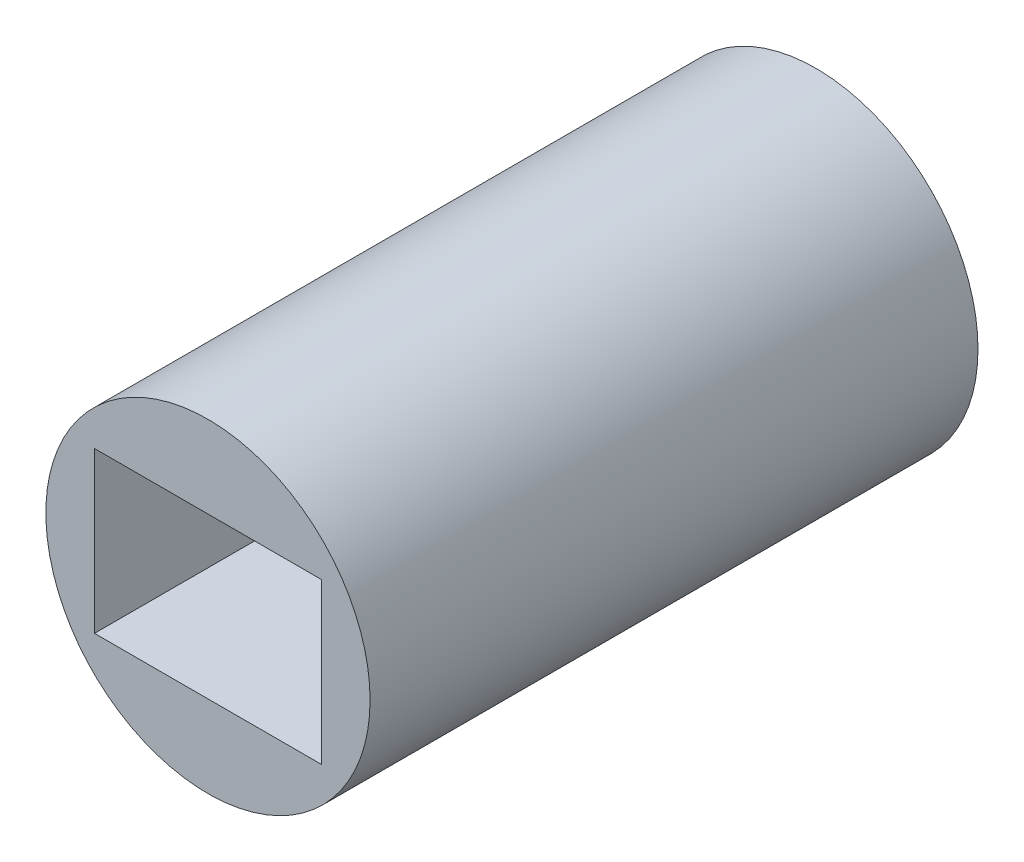
ISO-10303-21;
HEADER;
FILE_DESCRIPTION(('STEP AP214'),'2;1');
FILE_NAME('part.step','',(''),(''),'','','');
FILE_SCHEMA(('AUTOMOTIVE_DESIGN { 1 0 10303 214 1 1 1 1 }'));
ENDSEC;
DATA;
#1=APPLICATION_CONTEXT('core data for automotive mechanical design processes');
#2=APPLICATION_PROTOCOL_DEFINITION('international standard','automotive_design',2000,#1);
#3=PRODUCT_CONTEXT('',#1,'mechanical');
#4=PRODUCT('Part','Part','',(#3));
#5=PRODUCT_RELATED_PRODUCT_CATEGORY('part','',(#4));
#6=PRODUCT_DEFINITION_FORMATION('','',#4);
#7=PRODUCT_DEFINITION_CONTEXT('part definition',#1,'design');
#8=PRODUCT_DEFINITION('design','',#6,#7);
#9=PRODUCT_DEFINITION_SHAPE('','',#8);
#10=(LENGTH_UNIT() NAMED_UNIT(*) SI_UNIT(.MILLI.,.METRE.));
#11=(NAMED_UNIT(*) PLANE_ANGLE_UNIT() SI_UNIT($,.RADIAN.));
#12=(NAMED_UNIT(*) SI_UNIT($,.STERADIAN.) SOLID_ANGLE_UNIT());
#13=UNCERTAINTY_MEASURE_WITH_UNIT(LENGTH_MEASURE(1.E-05),#10,'distance_accuracy_value','');
#14=(GEOMETRIC_REPRESENTATION_CONTEXT(3) GLOBAL_UNCERTAINTY_ASSIGNED_CONTEXT((#13)) GLOBAL_UNIT_ASSIGNED_CONTEXT((#10,
#11,#12)) REPRESENTATION_CONTEXT('',''));
#15=CARTESIAN_POINT('',(0.,0.,0.));
#16=DIRECTION('',(0.,0.,1.));
#17=DIRECTION('',(1.,0.,0.));
#18=AXIS2_PLACEMENT_3D('',#15,#16,#17);
#19=CARTESIAN_POINT('',(0.,0.,7.));
#20=DIRECTION('',(0.,0.,-1.));
#21=DIRECTION('',(-1.,0.,0.));
#22=AXIS2_PLACEMENT_3D('',#19,#20,#21);
#23=PLANE('',#22);
#24=DIRECTION('',(-1.,0.,0.));
#25=VECTOR('',#24,1.);
#26=CARTESIAN_POINT('',(-2.8,1.975,7.));
#27=LINE('',#26,#25);
#28=CARTESIAN_POINT('',(2.8,1.975,7.));
#29=VERTEX_POINT('',#28);
#30=CARTESIAN_POINT('',(0.954226095746665,1.975,7.));
#31=VERTEX_POINT('',#30);
#32=EDGE_CURVE('E322',#29,#31,#27,.T.);
#33=ORIENTED_EDGE('',*,*,#32,.T.);
#34=DIRECTION('',(0.,-1.,0.));
#35=VECTOR('',#34,1.);
#36=CARTESIAN_POINT('',(0.954226095746662,0.,7.));
#37=LINE('',#36,#35);
#38=CARTESIAN_POINT('',(0.954226095746664,1.44772926198689,7.));
#39=VERTEX_POINT('',#38);
#40=EDGE_CURVE('E237',#31,#39,#37,.T.);
#41=ORIENTED_EDGE('',*,*,#40,.T.);
#42=CARTESIAN_POINT('',(1.71167067400128,1.70517384024148,7.));
#43=DIRECTION('',(0.,0.,-1.));
#44=DIRECTION('',(-1.,0.,0.));
#45=AXIS2_PLACEMENT_3D('',#42,#43,#44);
#46=CIRCLE('',#45,0.800000000000001);
#47=CARTESIAN_POINT('',(1.45422609574668,0.947729261986869,7.));
#48=VERTEX_POINT('',#47);
#49=EDGE_CURVE('E241',#48,#39,#46,.T.);
#50=ORIENTED_EDGE('',*,*,#49,.F.);
#51=DIRECTION('',(-1.,0.,0.));
#52=VECTOR('',#51,1.);
#53=CARTESIAN_POINT('',(0.,0.947729261986868,7.));
#54=LINE('',#53,#52);
#55=CARTESIAN_POINT('',(2.4530907267401,0.94772926198687,7.));
#56=VERTEX_POINT('',#55);
#57=EDGE_CURVE('E243',#56,#48,#54,.T.);
#58=ORIENTED_EDGE('',*,*,#57,.F.);
#59=CARTESIAN_POINT('',(-1.43245942735649,-0.00227073801313066,7.));
#60=DIRECTION('',(0.,0.,-1.));
#61=DIRECTION('',(-1.,0.,0.));
#62=AXIS2_PLACEMENT_3D('',#59,#60,#61);
#63=CIRCLE('',#62,4.);
#64=CARTESIAN_POINT('',(2.4530907267401,-0.952270738013131,7.));
#65=VERTEX_POINT('',#64);
#66=EDGE_CURVE('E189',#56,#65,#63,.T.);
#67=ORIENTED_EDGE('',*,*,#66,.T.);
#68=DIRECTION('',(-1.,0.,0.));
#69=VECTOR('',#68,1.);
#70=CARTESIAN_POINT('',(0.,-0.952270738013128,7.));
#71=LINE('',#70,#69);
#72=CARTESIAN_POINT('',(1.45195535773355,-0.95227073801313,7.));
#73=VERTEX_POINT('',#72);
#74=EDGE_CURVE('E186',#65,#73,#71,.T.);
#75=ORIENTED_EDGE('',*,*,#74,.T.);
#76=CARTESIAN_POINT('',(1.70939993598815,-1.70971531626775,7.));
#77=DIRECTION('',(0.,0.,-1.));
#78=DIRECTION('',(-1.,0.,0.));
#79=AXIS2_PLACEMENT_3D('',#76,#77,#78);
#80=CIRCLE('',#79,0.800000000000001);
#81=CARTESIAN_POINT('',(0.951955357733533,-1.45227073801315,7.));
#82=VERTEX_POINT('',#81);
#83=EDGE_CURVE('E192',#73,#82,#80,.F.);
#84=ORIENTED_EDGE('',*,*,#83,.T.);
#85=DIRECTION('',(0.,1.,0.));
#86=VECTOR('',#85,1.);
#87=CARTESIAN_POINT('',(0.951955357733533,0.,7.));
#88=LINE('',#87,#86);
#89=CARTESIAN_POINT('',(0.951955357733533,-1.975,7.));
#90=VERTEX_POINT('',#89);
#91=EDGE_CURVE('E196',#90,#82,#88,.T.);
#92=ORIENTED_EDGE('',*,*,#91,.F.);
#93=DIRECTION('',(1.,0.,0.));
#94=VECTOR('',#93,1.);
#95=CARTESIAN_POINT('',(-2.8,-1.975,7.));
#96=LINE('',#95,#94);
#97=CARTESIAN_POINT('',(2.8,-1.975,7.));
#98=VERTEX_POINT('',#97);
#99=EDGE_CURVE('E328',#90,#98,#96,.T.);
#100=ORIENTED_EDGE('',*,*,#99,.T.);
#101=DIRECTION('',(0.,1.,0.));
#102=VECTOR('',#101,1.);
#103=CARTESIAN_POINT('',(2.8,-1.975,7.));
#104=LINE('',#103,#102);
#105=EDGE_CURVE('E317',#98,#29,#104,.T.);
#106=ORIENTED_EDGE('',*,*,#105,.T.);
#107=EDGE_LOOP('',(#33,#41,#50,#58,#67,#75,#84,#92,#100,#106));
#108=FACE_BOUND('',#107,.T.);
#109=ADVANCED_FACE('F35',(#108),#23,.F.);
#110=CARTESIAN_POINT('',(0.,0.,0.));
#111=DIRECTION('',(0.,0.,1.));
#112=DIRECTION('',(1.,0.,0.));
#113=AXIS2_PLACEMENT_3D('',#110,#111,#112);
#114=PLANE('',#113);
#115=CARTESIAN_POINT('',(0.,0.,0.));
#116=DIRECTION('',(0.,0.,1.));
#117=DIRECTION('',(1.,0.,0.));
#118=AXIS2_PLACEMENT_3D('',#115,#116,#117);
#119=CIRCLE('',#118,4.);
#120=CARTESIAN_POINT('',(4.,0.,0.));
#121=VERTEX_POINT('',#120);
#122=EDGE_CURVE('E39',#121,#121,#119,.T.);
#123=ORIENTED_EDGE('',*,*,#122,.F.);
#124=EDGE_LOOP('',(#123));
#125=FACE_BOUND('',#124,.T.);
#126=CARTESIAN_POINT('',(1.70939993598815,-1.70971531626775,0.));
#127=DIRECTION('',(0.,0.,-1.));
#128=DIRECTION('',(-1.,0.,0.));
#129=AXIS2_PLACEMENT_3D('',#126,#127,#128);
#130=CIRCLE('',#129,0.800000000000001);
#131=CARTESIAN_POINT('',(1.45195535773355,-0.95227073801313,0.));
#132=VERTEX_POINT('',#131);
#133=CARTESIAN_POINT('',(0.951955357733533,-1.45227073801315,0.));
#134=VERTEX_POINT('',#133);
#135=EDGE_CURVE('E247',#132,#134,#130,.F.);
#136=ORIENTED_EDGE('',*,*,#135,.F.);
#137=DIRECTION('',(-1.,0.,0.));
#138=VECTOR('',#137,1.);
#139=CARTESIAN_POINT('',(0.,-0.952270738013128,0.));
#140=LINE('',#139,#138);
#141=CARTESIAN_POINT('',(2.4530907267401,-0.952270738013131,0.));
#142=VERTEX_POINT('',#141);
#143=EDGE_CURVE('E58',#142,#132,#140,.T.);
#144=ORIENTED_EDGE('',*,*,#143,.F.);
#145=CARTESIAN_POINT('',(-1.43245942735649,-0.00227073801313066,0.));
#146=DIRECTION('',(0.,0.,-1.));
#147=DIRECTION('',(-1.,0.,0.));
#148=AXIS2_PLACEMENT_3D('',#145,#146,#147);
#149=CIRCLE('',#148,4.);
#150=CARTESIAN_POINT('',(2.4530907267401,0.94772926198687,0.));
#151=VERTEX_POINT('',#150);
#152=EDGE_CURVE('E201',#151,#142,#149,.T.);
#153=ORIENTED_EDGE('',*,*,#152,.F.);
#154=DIRECTION('',(-1.,0.,0.));
#155=VECTOR('',#154,1.);
#156=CARTESIAN_POINT('',(0.,0.947729261986868,0.));
#157=LINE('',#156,#155);
#158=CARTESIAN_POINT('',(1.45422609574668,0.947729261986869,0.));
#159=VERTEX_POINT('',#158);
#160=EDGE_CURVE('E204',#151,#159,#157,.T.);
#161=ORIENTED_EDGE('',*,*,#160,.T.);
#162=CARTESIAN_POINT('',(1.71167067400128,1.70517384024148,0.));
#163=DIRECTION('',(0.,0.,-1.));
#164=DIRECTION('',(-1.,0.,0.));
#165=AXIS2_PLACEMENT_3D('',#162,#163,#164);
#166=CIRCLE('',#165,0.800000000000001);
#167=CARTESIAN_POINT('',(0.954226095746664,1.44772926198689,0.));
#168=VERTEX_POINT('',#167);
#169=EDGE_CURVE('E282',#159,#168,#166,.T.);
#170=ORIENTED_EDGE('',*,*,#169,.T.);
#171=DIRECTION('',(0.,-1.,0.));
#172=VECTOR('',#171,1.);
#173=CARTESIAN_POINT('',(0.954226095746662,0.,0.));
#174=LINE('',#173,#172);
#175=CARTESIAN_POINT('',(0.954226095746666,2.44886463099344,0.));
#176=VERTEX_POINT('',#175);
#177=EDGE_CURVE('E279',#176,#168,#174,.T.);
#178=ORIENTED_EDGE('',*,*,#177,.F.);
#179=CARTESIAN_POINT('',(0.00422609574666499,-1.43668552310315,0.));
#180=DIRECTION('',(0.,0.,-1.));
#181=DIRECTION('',(-1.,0.,0.));
#182=AXIS2_PLACEMENT_3D('',#179,#180,#181);
#183=CIRCLE('',#182,4.);
#184=CARTESIAN_POINT('',(-0.945773904253334,2.44886463099344,0.));
#185=VERTEX_POINT('',#184);
#186=EDGE_CURVE('E276',#185,#176,#183,.T.);
#187=ORIENTED_EDGE('',*,*,#186,.F.);
#188=DIRECTION('',(0.,-1.,0.));
#189=VECTOR('',#188,1.);
#190=CARTESIAN_POINT('',(-0.945773904253335,0.,0.));
#191=LINE('',#190,#189);
#192=CARTESIAN_POINT('',(-0.945773904253334,1.45000000000002,0.));
#193=VERTEX_POINT('',#192);
#194=EDGE_CURVE('E273',#185,#193,#191,.T.);
#195=ORIENTED_EDGE('',*,*,#194,.T.);
#196=CARTESIAN_POINT('',(-1.70321848250795,1.70744457825462,0.));
#197=DIRECTION('',(0.,0.,-1.));
#198=DIRECTION('',(-1.,0.,0.));
#199=AXIS2_PLACEMENT_3D('',#196,#197,#198);
#200=CIRCLE('',#199,0.8);
#201=CARTESIAN_POINT('',(-1.44577390425335,0.95,0.));
#202=VERTEX_POINT('',#201);
#203=EDGE_CURVE('E270',#193,#202,#200,.T.);
#204=ORIENTED_EDGE('',*,*,#203,.T.);
#205=DIRECTION('',(1.,0.,0.));
#206=VECTOR('',#205,1.);
#207=CARTESIAN_POINT('',(0.,0.949999999999997,0.));
#208=LINE('',#207,#206);
#209=CARTESIAN_POINT('',(-2.4469092732599,0.950000000000002,0.));
#210=VERTEX_POINT('',#209);
#211=EDGE_CURVE('E267',#210,#202,#208,.T.);
#212=ORIENTED_EDGE('',*,*,#211,.F.);
#213=CARTESIAN_POINT('',(1.43864088083668,0.,0.));
#214=DIRECTION('',(0.,0.,-1.));
#215=DIRECTION('',(-1.,0.,0.));
#216=AXIS2_PLACEMENT_3D('',#213,#214,#215);
#217=CIRCLE('',#216,4.);
#218=CARTESIAN_POINT('',(-2.4469092732599,-0.949999999999998,0.));
#219=VERTEX_POINT('',#218);
#220=EDGE_CURVE('E264',#219,#210,#217,.T.);
#221=ORIENTED_EDGE('',*,*,#220,.F.);
#222=DIRECTION('',(1.,0.,0.));
#223=VECTOR('',#222,1.);
#224=CARTESIAN_POINT('',(0.,-0.95,0.));
#225=LINE('',#224,#223);
#226=CARTESIAN_POINT('',(-1.44804464226649,-0.949999999999999,0.));
#227=VERTEX_POINT('',#226);
#228=EDGE_CURVE('E261',#219,#227,#225,.T.);
#229=ORIENTED_EDGE('',*,*,#228,.T.);
#230=CARTESIAN_POINT('',(-1.76445974035885,-1.76641509809238,0.));
#231=DIRECTION('',(0.,0.,-1.));
#232=DIRECTION('',(-1.,0.,0.));
#233=AXIS2_PLACEMENT_3D('',#230,#231,#232);
#234=CIRCLE('',#233,0.875586732822055);
#235=CARTESIAN_POINT('',(-0.948044642266466,-1.45000000000002,0.));
#236=VERTEX_POINT('',#235);
#237=EDGE_CURVE('E258',#236,#227,#234,.F.);
#238=ORIENTED_EDGE('',*,*,#237,.F.);
#239=DIRECTION('',(0.,1.,0.));
#240=VECTOR('',#239,1.);
#241=CARTESIAN_POINT('',(-0.948044642266465,0.,0.));
#242=LINE('',#241,#240);
#243=CARTESIAN_POINT('',(-0.948044642266466,-2.45113536900657,0.));
#244=VERTEX_POINT('',#243);
#245=EDGE_CURVE('E255',#244,#236,#242,.T.);
#246=ORIENTED_EDGE('',*,*,#245,.F.);
#247=CARTESIAN_POINT('',(0.00195535773353365,1.43441478509002,0.));
#248=DIRECTION('',(0.,0.,-1.));
#249=DIRECTION('',(-1.,0.,0.));
#250=AXIS2_PLACEMENT_3D('',#247,#248,#249);
#251=CIRCLE('',#250,4.);
#252=CARTESIAN_POINT('',(0.951955357733533,-2.45113536900657,0.));
#253=VERTEX_POINT('',#252);
#254=EDGE_CURVE('E252',#253,#244,#251,.T.);
#255=ORIENTED_EDGE('',*,*,#254,.F.);
#256=DIRECTION('',(0.,1.,0.));
#257=VECTOR('',#256,1.);
#258=CARTESIAN_POINT('',(0.951955357733533,0.,0.));
#259=LINE('',#258,#257);
#260=EDGE_CURVE('E249',#253,#134,#259,.T.);
#261=ORIENTED_EDGE('',*,*,#260,.T.);
#262=EDGE_LOOP('',(#136,#144,#153,#161,#170,#178,#187,#195,#204,#212,#221,#229,#238,#246,#255,#261));
#263=FACE_BOUND('',#262,.T.);
#264=ADVANCED_FACE('F391',(#125,#263),#114,.F.);
#265=CARTESIAN_POINT('',(0.,0.,15.));
#266=DIRECTION('',(0.,0.,-1.));
#267=DIRECTION('',(-1.,0.,0.));
#268=AXIS2_PLACEMENT_3D('',#265,#266,#267);
#269=CYLINDRICAL_SURFACE('',#268,4.);
#270=CARTESIAN_POINT('',(0.,0.,15.));
#271=DIRECTION('',(0.,0.,1.));
#272=DIRECTION('',(1.,0.,0.));
#273=AXIS2_PLACEMENT_3D('',#270,#271,#272);
#274=CIRCLE('',#273,4.);
#275=CARTESIAN_POINT('',(4.,0.,15.));
#276=VERTEX_POINT('',#275);
#277=EDGE_CURVE('E11',#276,#276,#274,.T.);
#278=ORIENTED_EDGE('',*,*,#277,.F.);
#279=EDGE_LOOP('',(#278));
#280=FACE_BOUND('',#279,.T.);
#281=ORIENTED_EDGE('',*,*,#122,.T.);
#282=EDGE_LOOP('',(#281));
#283=FACE_BOUND('',#282,.T.);
#284=ADVANCED_FACE('F37',(#280,#283),#269,.T.);
#285=CARTESIAN_POINT('',(0.,0.,15.));
#286=DIRECTION('',(0.,0.,1.));
#287=DIRECTION('',(1.,0.,0.));
#288=AXIS2_PLACEMENT_3D('',#285,#286,#287);
#289=PLANE('',#288);
#290=DIRECTION('',(0.,1.,0.));
#291=VECTOR('',#290,1.);
#292=CARTESIAN_POINT('',(2.8,-1.975,15.));
#293=LINE('',#292,#291);
#294=CARTESIAN_POINT('',(2.8,-1.975,15.));
#295=VERTEX_POINT('',#294);
#296=CARTESIAN_POINT('',(2.8,1.975,15.));
#297=VERTEX_POINT('',#296);
#298=EDGE_CURVE('E289',#295,#297,#293,.T.);
#299=ORIENTED_EDGE('',*,*,#298,.F.);
#300=DIRECTION('',(1.,0.,0.));
#301=VECTOR('',#300,1.);
#302=CARTESIAN_POINT('',(-2.8,-1.975,15.));
#303=LINE('',#302,#301);
#304=CARTESIAN_POINT('',(-2.8,-1.975,15.));
#305=VERTEX_POINT('',#304);
#306=EDGE_CURVE('E321',#305,#295,#303,.T.);
#307=ORIENTED_EDGE('',*,*,#306,.F.);
#308=DIRECTION('',(0.,-1.,0.));
#309=VECTOR('',#308,1.);
#310=CARTESIAN_POINT('',(-2.8,-1.975,15.));
#311=LINE('',#310,#309);
#312=CARTESIAN_POINT('',(-2.8,1.975,15.));
#313=VERTEX_POINT('',#312);
#314=EDGE_CURVE('E338',#313,#305,#311,.T.);
#315=ORIENTED_EDGE('',*,*,#314,.F.);
#316=DIRECTION('',(-1.,0.,0.));
#317=VECTOR('',#316,1.);
#318=CARTESIAN_POINT('',(-2.8,1.975,15.));
#319=LINE('',#318,#317);
#320=EDGE_CURVE('E335',#297,#313,#319,.T.);
#321=ORIENTED_EDGE('',*,*,#320,.F.);
#322=EDGE_LOOP('',(#299,#307,#315,#321));
#323=FACE_BOUND('',#322,.T.);
#324=ORIENTED_EDGE('',*,*,#277,.T.);
#325=EDGE_LOOP('',(#324));
#326=FACE_BOUND('',#325,.T.);
#327=ADVANCED_FACE('F361',(#323,#326),#289,.T.);
#328=CARTESIAN_POINT('',(2.8,-1.975,7.));
#329=DIRECTION('',(1.,0.,0.));
#330=DIRECTION('',(0.,0.,-1.));
#331=AXIS2_PLACEMENT_3D('',#328,#329,#330);
#332=PLANE('',#331);
#333=ORIENTED_EDGE('',*,*,#298,.T.);
#334=DIRECTION('',(0.,0.,1.));
#335=VECTOR('',#334,1.);
#336=CARTESIAN_POINT('',(2.8,1.975,7.));
#337=LINE('',#336,#335);
#338=EDGE_CURVE('E332',#29,#297,#337,.T.);
#339=ORIENTED_EDGE('',*,*,#338,.F.);
#340=ORIENTED_EDGE('',*,*,#105,.F.);
#341=DIRECTION('',(0.,0.,1.));
#342=VECTOR('',#341,1.);
#343=CARTESIAN_POINT('',(2.8,-1.975,7.));
#344=LINE('',#343,#342);
#345=EDGE_CURVE('E343',#98,#295,#344,.T.);
#346=ORIENTED_EDGE('',*,*,#345,.T.);
#347=EDGE_LOOP('',(#333,#339,#340,#346));
#348=FACE_BOUND('',#347,.T.);
#349=ADVANCED_FACE('F403',(#348),#332,.F.);
#350=CARTESIAN_POINT('',(-2.8,-1.975,7.));
#351=DIRECTION('',(0.,-1.,0.));
#352=DIRECTION('',(0.,0.,-1.));
#353=AXIS2_PLACEMENT_3D('',#350,#351,#352);
#354=PLANE('',#353);
#355=ORIENTED_EDGE('',*,*,#306,.T.);
#356=ORIENTED_EDGE('',*,*,#345,.F.);
#357=ORIENTED_EDGE('',*,*,#99,.F.);
#358=CARTESIAN_POINT('',(-0.948044642266466,-1.975,7.));
#359=VERTEX_POINT('',#358);
#360=EDGE_CURVE('E333',#359,#90,#96,.T.);
#361=ORIENTED_EDGE('',*,*,#360,.F.);
#362=CARTESIAN_POINT('',(-2.8,-1.975,7.));
#363=VERTEX_POINT('',#362);
#364=EDGE_CURVE('E329',#363,#359,#96,.T.);
#365=ORIENTED_EDGE('',*,*,#364,.F.);
#366=DIRECTION('',(0.,0.,1.));
#367=VECTOR('',#366,1.);
#368=CARTESIAN_POINT('',(-2.8,-1.975,7.));
#369=LINE('',#368,#367);
#370=EDGE_CURVE('E345',#363,#305,#369,.T.);
#371=ORIENTED_EDGE('',*,*,#370,.T.);
#372=EDGE_LOOP('',(#355,#356,#357,#361,#365,#371));
#373=FACE_BOUND('',#372,.T.);
#374=ADVANCED_FACE('F405',(#373),#354,.F.);
#375=CARTESIAN_POINT('',(-2.8,-1.975,7.));
#376=DIRECTION('',(-1.,0.,0.));
#377=DIRECTION('',(0.,0.,1.));
#378=AXIS2_PLACEMENT_3D('',#375,#376,#377);
#379=PLANE('',#378);
#380=ORIENTED_EDGE('',*,*,#314,.T.);
#381=ORIENTED_EDGE('',*,*,#370,.F.);
#382=DIRECTION('',(0.,-1.,0.));
#383=VECTOR('',#382,1.);
#384=CARTESIAN_POINT('',(-2.8,-1.975,7.));
#385=LINE('',#384,#383);
#386=CARTESIAN_POINT('',(-2.8,1.975,7.));
#387=VERTEX_POINT('',#386);
#388=EDGE_CURVE('E324',#387,#363,#385,.T.);
#389=ORIENTED_EDGE('',*,*,#388,.F.);
#390=DIRECTION('',(0.,0.,1.));
#391=VECTOR('',#390,1.);
#392=CARTESIAN_POINT('',(-2.8,1.975,7.));
#393=LINE('',#392,#391);
#394=EDGE_CURVE('E347',#387,#313,#393,.T.);
#395=ORIENTED_EDGE('',*,*,#394,.T.);
#396=EDGE_LOOP('',(#380,#381,#389,#395));
#397=FACE_BOUND('',#396,.T.);
#398=ADVANCED_FACE('F365',(#397),#379,.F.);
#399=CARTESIAN_POINT('',(-2.8,1.975,7.));
#400=DIRECTION('',(0.,1.,0.));
#401=DIRECTION('',(0.,0.,1.));
#402=AXIS2_PLACEMENT_3D('',#399,#400,#401);
#403=PLANE('',#402);
#404=ORIENTED_EDGE('',*,*,#320,.T.);
#405=ORIENTED_EDGE('',*,*,#394,.F.);
#406=CARTESIAN_POINT('',(-0.945773904253334,1.975,7.));
#407=VERTEX_POINT('',#406);
#408=EDGE_CURVE('E320',#407,#387,#27,.T.);
#409=ORIENTED_EDGE('',*,*,#408,.F.);
#410=EDGE_CURVE('E325',#31,#407,#27,.T.);
#411=ORIENTED_EDGE('',*,*,#410,.F.);
#412=ORIENTED_EDGE('',*,*,#32,.F.);
#413=ORIENTED_EDGE('',*,*,#338,.T.);
#414=EDGE_LOOP('',(#404,#405,#409,#411,#412,#413));
#415=FACE_BOUND('',#414,.T.);
#416=ADVANCED_FACE('F353',(#415),#403,.F.);
#417=DIRECTION('',(0.,-1.,0.));
#418=VECTOR('',#417,1.);
#419=CARTESIAN_POINT('',(-0.945773904253335,0.,7.));
#420=LINE('',#419,#418);
#421=CARTESIAN_POINT('',(-0.945773904253334,1.45000000000002,7.));
#422=VERTEX_POINT('',#421);
#423=EDGE_CURVE('E230',#407,#422,#420,.T.);
#424=ORIENTED_EDGE('',*,*,#423,.F.);
#425=ORIENTED_EDGE('',*,*,#408,.T.);
#426=ORIENTED_EDGE('',*,*,#388,.T.);
#427=ORIENTED_EDGE('',*,*,#364,.T.);
#428=DIRECTION('',(0.,1.,0.));
#429=VECTOR('',#428,1.);
#430=CARTESIAN_POINT('',(-0.948044642266465,0.,7.));
#431=LINE('',#430,#429);
#432=CARTESIAN_POINT('',(-0.948044642266466,-1.45000000000002,7.));
#433=VERTEX_POINT('',#432);
#434=EDGE_CURVE('E213',#359,#433,#431,.T.);
#435=ORIENTED_EDGE('',*,*,#434,.T.);
#436=CARTESIAN_POINT('',(-1.76445974035885,-1.76641509809238,7.));
#437=DIRECTION('',(0.,0.,-1.));
#438=DIRECTION('',(-1.,0.,0.));
#439=AXIS2_PLACEMENT_3D('',#436,#437,#438);
#440=CIRCLE('',#439,0.875586732822055);
#441=CARTESIAN_POINT('',(-1.44804464226649,-0.949999999999999,7.));
#442=VERTEX_POINT('',#441);
#443=EDGE_CURVE('E217',#433,#442,#440,.F.);
#444=ORIENTED_EDGE('',*,*,#443,.T.);
#445=DIRECTION('',(1.,0.,0.));
#446=VECTOR('',#445,1.);
#447=CARTESIAN_POINT('',(0.,-0.95,7.));
#448=LINE('',#447,#446);
#449=CARTESIAN_POINT('',(-2.4469092732599,-0.949999999999998,7.));
#450=VERTEX_POINT('',#449);
#451=EDGE_CURVE('E220',#450,#442,#448,.T.);
#452=ORIENTED_EDGE('',*,*,#451,.F.);
#453=CARTESIAN_POINT('',(1.43864088083668,0.,7.));
#454=DIRECTION('',(0.,0.,-1.));
#455=DIRECTION('',(-1.,0.,0.));
#456=AXIS2_PLACEMENT_3D('',#453,#454,#455);
#457=CIRCLE('',#456,4.);
#458=CARTESIAN_POINT('',(-2.4469092732599,0.950000000000002,7.));
#459=VERTEX_POINT('',#458);
#460=EDGE_CURVE('E222',#450,#459,#457,.T.);
#461=ORIENTED_EDGE('',*,*,#460,.T.);
#462=DIRECTION('',(1.,0.,0.));
#463=VECTOR('',#462,1.);
#464=CARTESIAN_POINT('',(0.,0.949999999999997,7.));
#465=LINE('',#464,#463);
#466=CARTESIAN_POINT('',(-1.44577390425335,0.95,7.));
#467=VERTEX_POINT('',#466);
#468=EDGE_CURVE('E225',#459,#467,#465,.T.);
#469=ORIENTED_EDGE('',*,*,#468,.T.);
#470=CARTESIAN_POINT('',(-1.70321848250795,1.70744457825462,7.));
#471=DIRECTION('',(0.,0.,-1.));
#472=DIRECTION('',(-1.,0.,0.));
#473=AXIS2_PLACEMENT_3D('',#470,#471,#472);
#474=CIRCLE('',#473,0.8);
#475=EDGE_CURVE('E228',#422,#467,#474,.T.);
#476=ORIENTED_EDGE('',*,*,#475,.F.);
#477=EDGE_LOOP('',(#424,#425,#426,#427,#435,#444,#452,#461,#469,#476));
#478=FACE_BOUND('',#477,.T.);
#479=ADVANCED_FACE('F380',(#478),#23,.F.);
#480=CARTESIAN_POINT('',(0.,0.,7.));
#481=DIRECTION('',(0.,0.,-1.));
#482=DIRECTION('',(-1.,0.,0.));
#483=AXIS2_PLACEMENT_3D('',#480,#481,#482);
#484=PLANE('',#483);
#485=ORIENTED_EDGE('',*,*,#410,.T.);
#486=CARTESIAN_POINT('',(-0.945773904253334,2.44886463099344,7.));
#487=VERTEX_POINT('',#486);
#488=EDGE_CURVE('E231',#487,#407,#420,.T.);
#489=ORIENTED_EDGE('',*,*,#488,.F.);
#490=CARTESIAN_POINT('',(0.00422609574666499,-1.43668552310315,7.));
#491=DIRECTION('',(0.,0.,-1.));
#492=DIRECTION('',(-1.,0.,0.));
#493=AXIS2_PLACEMENT_3D('',#490,#491,#492);
#494=CIRCLE('',#493,4.);
#495=CARTESIAN_POINT('',(0.954226095746666,2.44886463099344,7.));
#496=VERTEX_POINT('',#495);
#497=EDGE_CURVE('E234',#487,#496,#494,.T.);
#498=ORIENTED_EDGE('',*,*,#497,.T.);
#499=EDGE_CURVE('E238',#496,#31,#37,.T.);
#500=ORIENTED_EDGE('',*,*,#499,.T.);
#501=EDGE_LOOP('',(#485,#489,#498,#500));
#502=FACE_BOUND('',#501,.T.);
#503=ADVANCED_FACE('F372',(#502),#484,.T.);
#504=ORIENTED_EDGE('',*,*,#360,.T.);
#505=CARTESIAN_POINT('',(0.951955357733533,-2.45113536900657,7.));
#506=VERTEX_POINT('',#505);
#507=EDGE_CURVE('E207',#506,#90,#88,.T.);
#508=ORIENTED_EDGE('',*,*,#507,.F.);
#509=CARTESIAN_POINT('',(0.00195535773353365,1.43441478509002,7.));
#510=DIRECTION('',(0.,0.,-1.));
#511=DIRECTION('',(-1.,0.,0.));
#512=AXIS2_PLACEMENT_3D('',#509,#510,#511);
#513=CIRCLE('',#512,4.);
#514=CARTESIAN_POINT('',(-0.948044642266466,-2.45113536900657,7.));
#515=VERTEX_POINT('',#514);
#516=EDGE_CURVE('E210',#506,#515,#513,.T.);
#517=ORIENTED_EDGE('',*,*,#516,.T.);
#518=EDGE_CURVE('E214',#515,#359,#431,.T.);
#519=ORIENTED_EDGE('',*,*,#518,.T.);
#520=EDGE_LOOP('',(#504,#508,#517,#519));
#521=FACE_BOUND('',#520,.T.);
#522=ADVANCED_FACE('F415',(#521),#484,.T.);
#523=CARTESIAN_POINT('',(0.,-0.952270738013128,7.));
#524=DIRECTION('',(0.,-1.,0.));
#525=DIRECTION('',(1.,0.,0.));
#526=AXIS2_PLACEMENT_3D('',#523,#524,#525);
#527=PLANE('',#526);
#528=ORIENTED_EDGE('',*,*,#143,.T.);
#529=DIRECTION('',(0.,0.,-1.));
#530=VECTOR('',#529,1.);
#531=CARTESIAN_POINT('',(1.45195535773355,-0.95227073801313,7.));
#532=LINE('',#531,#530);
#533=EDGE_CURVE('E183',#73,#132,#532,.T.);
#534=ORIENTED_EDGE('',*,*,#533,.F.);
#535=ORIENTED_EDGE('',*,*,#74,.F.);
#536=DIRECTION('',(0.,0.,-1.));
#537=VECTOR('',#536,1.);
#538=CARTESIAN_POINT('',(2.4530907267401,-0.952270738013131,7.));
#539=LINE('',#538,#537);
#540=EDGE_CURVE('E287',#65,#142,#539,.T.);
#541=ORIENTED_EDGE('',*,*,#540,.T.);
#542=EDGE_LOOP('',(#528,#534,#535,#541));
#543=FACE_BOUND('',#542,.T.);
#544=ADVANCED_FACE('F184',(#543),#527,.F.);
#545=CARTESIAN_POINT('',(-1.43245942735649,-0.00227073801313066,7.));
#546=DIRECTION('',(0.,0.,-1.));
#547=DIRECTION('',(-1.,0.,0.));
#548=AXIS2_PLACEMENT_3D('',#545,#546,#547);
#549=CYLINDRICAL_SURFACE('',#548,4.);
#550=ORIENTED_EDGE('',*,*,#152,.T.);
#551=ORIENTED_EDGE('',*,*,#540,.F.);
#552=ORIENTED_EDGE('',*,*,#66,.F.);
#553=DIRECTION('',(0.,0.,-1.));
#554=VECTOR('',#553,1.);
#555=CARTESIAN_POINT('',(2.4530907267401,0.94772926198687,7.));
#556=LINE('',#555,#554);
#557=EDGE_CURVE('E290',#56,#151,#556,.T.);
#558=ORIENTED_EDGE('',*,*,#557,.T.);
#559=EDGE_LOOP('',(#550,#551,#552,#558));
#560=FACE_BOUND('',#559,.T.);
#561=ADVANCED_FACE('F520',(#560),#549,.F.);
#562=CARTESIAN_POINT('',(0.,0.947729261986868,7.));
#563=DIRECTION('',(0.,-1.,0.));
#564=DIRECTION('',(1.,0.,0.));
#565=AXIS2_PLACEMENT_3D('',#562,#563,#564);
#566=PLANE('',#565);
#567=ORIENTED_EDGE('',*,*,#160,.F.);
#568=ORIENTED_EDGE('',*,*,#557,.F.);
#569=ORIENTED_EDGE('',*,*,#57,.T.);
#570=DIRECTION('',(0.,0.,-1.));
#571=VECTOR('',#570,1.);
#572=CARTESIAN_POINT('',(1.45422609574668,0.947729261986869,7.));
#573=LINE('',#572,#571);
#574=EDGE_CURVE('E292',#48,#159,#573,.T.);
#575=ORIENTED_EDGE('',*,*,#574,.T.);
#576=EDGE_LOOP('',(#567,#568,#569,#575));
#577=FACE_BOUND('',#576,.T.);
#578=ADVANCED_FACE('F528',(#577),#566,.T.);
#579=CARTESIAN_POINT('',(1.71167067400128,1.70517384024148,7.));
#580=DIRECTION('',(0.,0.,-1.));
#581=DIRECTION('',(-1.,0.,0.));
#582=AXIS2_PLACEMENT_3D('',#579,#580,#581);
#583=CYLINDRICAL_SURFACE('',#582,0.800000000000001);
#584=ORIENTED_EDGE('',*,*,#169,.F.);
#585=ORIENTED_EDGE('',*,*,#574,.F.);
#586=ORIENTED_EDGE('',*,*,#49,.T.);
#587=DIRECTION('',(0.,0.,-1.));
#588=VECTOR('',#587,1.);
#589=CARTESIAN_POINT('',(0.954226095746664,1.44772926198689,7.));
#590=LINE('',#589,#588);
#591=EDGE_CURVE('E294',#39,#168,#590,.T.);
#592=ORIENTED_EDGE('',*,*,#591,.T.);
#593=EDGE_LOOP('',(#584,#585,#586,#592));
#594=FACE_BOUND('',#593,.T.);
#595=ADVANCED_FACE('F538',(#594),#583,.T.);
#596=CARTESIAN_POINT('',(0.954226095746662,0.,7.));
#597=DIRECTION('',(1.,0.,0.));
#598=DIRECTION('',(0.,1.,0.));
#599=AXIS2_PLACEMENT_3D('',#596,#597,#598);
#600=PLANE('',#599);
#601=ORIENTED_EDGE('',*,*,#177,.T.);
#602=ORIENTED_EDGE('',*,*,#591,.F.);
#603=ORIENTED_EDGE('',*,*,#40,.F.);
#604=ORIENTED_EDGE('',*,*,#499,.F.);
#605=DIRECTION('',(0.,0.,-1.));
#606=VECTOR('',#605,1.);
#607=CARTESIAN_POINT('',(0.954226095746666,2.44886463099344,7.));
#608=LINE('',#607,#606);
#609=EDGE_CURVE('E296',#496,#176,#608,.T.);
#610=ORIENTED_EDGE('',*,*,#609,.T.);
#611=EDGE_LOOP('',(#601,#602,#603,#604,#610));
#612=FACE_BOUND('',#611,.T.);
#613=ADVANCED_FACE('F397',(#612),#600,.F.);
#614=CARTESIAN_POINT('',(0.00422609574666499,-1.43668552310315,7.));
#615=DIRECTION('',(0.,0.,-1.));
#616=DIRECTION('',(-1.,0.,0.));
#617=AXIS2_PLACEMENT_3D('',#614,#615,#616);
#618=CYLINDRICAL_SURFACE('',#617,4.);
#619=ORIENTED_EDGE('',*,*,#186,.T.);
#620=ORIENTED_EDGE('',*,*,#609,.F.);
#621=ORIENTED_EDGE('',*,*,#497,.F.);
#622=DIRECTION('',(0.,0.,-1.));
#623=VECTOR('',#622,1.);
#624=CARTESIAN_POINT('',(-0.945773904253334,2.44886463099344,7.));
#625=LINE('',#624,#623);
#626=EDGE_CURVE('E298',#487,#185,#625,.T.);
#627=ORIENTED_EDGE('',*,*,#626,.T.);
#628=EDGE_LOOP('',(#619,#620,#621,#627));
#629=FACE_BOUND('',#628,.T.);
#630=ADVANCED_FACE('F395',(#629),#618,.F.);
#631=CARTESIAN_POINT('',(-0.945773904253335,0.,7.));
#632=DIRECTION('',(1.,0.,0.));
#633=DIRECTION('',(0.,1.,0.));
#634=AXIS2_PLACEMENT_3D('',#631,#632,#633);
#635=PLANE('',#634);
#636=ORIENTED_EDGE('',*,*,#194,.F.);
#637=ORIENTED_EDGE('',*,*,#626,.F.);
#638=ORIENTED_EDGE('',*,*,#488,.T.);
#639=ORIENTED_EDGE('',*,*,#423,.T.);
#640=DIRECTION('',(0.,0.,-1.));
#641=VECTOR('',#640,1.);
#642=CARTESIAN_POINT('',(-0.945773904253334,1.45000000000002,7.));
#643=LINE('',#642,#641);
#644=EDGE_CURVE('E300',#422,#193,#643,.T.);
#645=ORIENTED_EDGE('',*,*,#644,.T.);
#646=EDGE_LOOP('',(#636,#637,#638,#639,#645));
#647=FACE_BOUND('',#646,.T.);
#648=ADVANCED_FACE('F377',(#647),#635,.T.);
#649=CARTESIAN_POINT('',(-1.70321848250795,1.70744457825462,7.));
#650=DIRECTION('',(0.,0.,-1.));
#651=DIRECTION('',(-1.,0.,0.));
#652=AXIS2_PLACEMENT_3D('',#649,#650,#651);
#653=CYLINDRICAL_SURFACE('',#652,0.8);
#654=ORIENTED_EDGE('',*,*,#203,.F.);
#655=ORIENTED_EDGE('',*,*,#644,.F.);
#656=ORIENTED_EDGE('',*,*,#475,.T.);
#657=DIRECTION('',(0.,0.,-1.));
#658=VECTOR('',#657,1.);
#659=CARTESIAN_POINT('',(-1.44577390425335,0.95,7.));
#660=LINE('',#659,#658);
#661=EDGE_CURVE('E302',#467,#202,#660,.T.);
#662=ORIENTED_EDGE('',*,*,#661,.T.);
#663=EDGE_LOOP('',(#654,#655,#656,#662));
#664=FACE_BOUND('',#663,.T.);
#665=ADVANCED_FACE('F385',(#664),#653,.T.);
#666=CARTESIAN_POINT('',(0.,0.949999999999997,7.));
#667=DIRECTION('',(0.,1.,0.));
#668=DIRECTION('',(-1.,0.,0.));
#669=AXIS2_PLACEMENT_3D('',#666,#667,#668);
#670=PLANE('',#669);
#671=ORIENTED_EDGE('',*,*,#211,.T.);
#672=ORIENTED_EDGE('',*,*,#661,.F.);
#673=ORIENTED_EDGE('',*,*,#468,.F.);
#674=DIRECTION('',(0.,0.,-1.));
#675=VECTOR('',#674,1.);
#676=CARTESIAN_POINT('',(-2.4469092732599,0.950000000000002,7.));
#677=LINE('',#676,#675);
#678=EDGE_CURVE('E304',#459,#210,#677,.T.);
#679=ORIENTED_EDGE('',*,*,#678,.T.);
#680=EDGE_LOOP('',(#671,#672,#673,#679));
#681=FACE_BOUND('',#680,.T.);
#682=ADVANCED_FACE('F387',(#681),#670,.F.);
#683=CARTESIAN_POINT('',(1.43864088083668,0.,7.));
#684=DIRECTION('',(0.,0.,-1.));
#685=DIRECTION('',(-1.,0.,0.));
#686=AXIS2_PLACEMENT_3D('',#683,#684,#685);
#687=CYLINDRICAL_SURFACE('',#686,4.);
#688=ORIENTED_EDGE('',*,*,#220,.T.);
#689=ORIENTED_EDGE('',*,*,#678,.F.);
#690=ORIENTED_EDGE('',*,*,#460,.F.);
#691=DIRECTION('',(0.,0.,-1.));
#692=VECTOR('',#691,1.);
#693=CARTESIAN_POINT('',(-2.4469092732599,-0.949999999999998,7.));
#694=LINE('',#693,#692);
#695=EDGE_CURVE('E306',#450,#219,#694,.T.);
#696=ORIENTED_EDGE('',*,*,#695,.T.);
#697=EDGE_LOOP('',(#688,#689,#690,#696));
#698=FACE_BOUND('',#697,.T.);
#699=ADVANCED_FACE('F432',(#698),#687,.F.);
#700=CARTESIAN_POINT('',(0.,-0.95,7.));
#701=DIRECTION('',(0.,1.,0.));
#702=DIRECTION('',(-1.,0.,0.));
#703=AXIS2_PLACEMENT_3D('',#700,#701,#702);
#704=PLANE('',#703);
#705=ORIENTED_EDGE('',*,*,#228,.F.);
#706=ORIENTED_EDGE('',*,*,#695,.F.);
#707=ORIENTED_EDGE('',*,*,#451,.T.);
#708=DIRECTION('',(0.,0.,-1.));
#709=VECTOR('',#708,1.);
#710=CARTESIAN_POINT('',(-1.44804464226649,-0.949999999999999,7.));
#711=LINE('',#710,#709);
#712=EDGE_CURVE('E308',#442,#227,#711,.T.);
#713=ORIENTED_EDGE('',*,*,#712,.T.);
#714=EDGE_LOOP('',(#705,#706,#707,#713));
#715=FACE_BOUND('',#714,.T.);
#716=ADVANCED_FACE('F429',(#715),#704,.T.);
#717=CARTESIAN_POINT('',(-1.76445974035885,-1.76641509809238,7.));
#718=DIRECTION('',(0.,0.,-1.));
#719=DIRECTION('',(-1.,0.,0.));
#720=AXIS2_PLACEMENT_3D('',#717,#718,#719);
#721=CYLINDRICAL_SURFACE('',#720,0.875586732822055);
#722=ORIENTED_EDGE('',*,*,#237,.T.);
#723=ORIENTED_EDGE('',*,*,#712,.F.);
#724=ORIENTED_EDGE('',*,*,#443,.F.);
#725=DIRECTION('',(0.,0.,-1.));
#726=VECTOR('',#725,1.);
#727=CARTESIAN_POINT('',(-0.948044642266466,-1.45000000000002,7.));
#728=LINE('',#727,#726);
#729=EDGE_CURVE('E310',#433,#236,#728,.T.);
#730=ORIENTED_EDGE('',*,*,#729,.T.);
#731=EDGE_LOOP('',(#722,#723,#724,#730));
#732=FACE_BOUND('',#731,.T.);
#733=ADVANCED_FACE('F427',(#732),#721,.T.);
#734=CARTESIAN_POINT('',(-0.948044642266465,0.,7.));
#735=DIRECTION('',(-1.,0.,0.));
#736=DIRECTION('',(0.,-1.,0.));
#737=AXIS2_PLACEMENT_3D('',#734,#735,#736);
#738=PLANE('',#737);
#739=ORIENTED_EDGE('',*,*,#245,.T.);
#740=ORIENTED_EDGE('',*,*,#729,.F.);
#741=ORIENTED_EDGE('',*,*,#434,.F.);
#742=ORIENTED_EDGE('',*,*,#518,.F.);
#743=DIRECTION('',(0.,0.,-1.));
#744=VECTOR('',#743,1.);
#745=CARTESIAN_POINT('',(-0.948044642266466,-2.45113536900657,7.));
#746=LINE('',#745,#744);
#747=EDGE_CURVE('E312',#515,#244,#746,.T.);
#748=ORIENTED_EDGE('',*,*,#747,.T.);
#749=EDGE_LOOP('',(#739,#740,#741,#742,#748));
#750=FACE_BOUND('',#749,.T.);
#751=ADVANCED_FACE('F413',(#750),#738,.F.);
#752=CARTESIAN_POINT('',(0.00195535773353365,1.43441478509002,7.));
#753=DIRECTION('',(0.,0.,-1.));
#754=DIRECTION('',(-1.,0.,0.));
#755=AXIS2_PLACEMENT_3D('',#752,#753,#754);
#756=CYLINDRICAL_SURFACE('',#755,4.);
#757=ORIENTED_EDGE('',*,*,#254,.T.);
#758=ORIENTED_EDGE('',*,*,#747,.F.);
#759=ORIENTED_EDGE('',*,*,#516,.F.);
#760=DIRECTION('',(0.,0.,-1.));
#761=VECTOR('',#760,1.);
#762=CARTESIAN_POINT('',(0.951955357733533,-2.45113536900657,7.));
#763=LINE('',#762,#761);
#764=EDGE_CURVE('E314',#506,#253,#763,.T.);
#765=ORIENTED_EDGE('',*,*,#764,.T.);
#766=EDGE_LOOP('',(#757,#758,#759,#765));
#767=FACE_BOUND('',#766,.T.);
#768=ADVANCED_FACE('F419',(#767),#756,.F.);
#769=CARTESIAN_POINT('',(0.951955357733533,0.,7.));
#770=DIRECTION('',(-1.,0.,0.));
#771=DIRECTION('',(0.,-1.,0.));
#772=AXIS2_PLACEMENT_3D('',#769,#770,#771);
#773=PLANE('',#772);
#774=ORIENTED_EDGE('',*,*,#260,.F.);
#775=ORIENTED_EDGE('',*,*,#764,.F.);
#776=ORIENTED_EDGE('',*,*,#507,.T.);
#777=ORIENTED_EDGE('',*,*,#91,.T.);
#778=DIRECTION('',(0.,0.,-1.));
#779=VECTOR('',#778,1.);
#780=CARTESIAN_POINT('',(0.951955357733533,-1.45227073801315,7.));
#781=LINE('',#780,#779);
#782=EDGE_CURVE('E50',#82,#134,#781,.T.);
#783=ORIENTED_EDGE('',*,*,#782,.T.);
#784=EDGE_LOOP('',(#774,#775,#776,#777,#783));
#785=FACE_BOUND('',#784,.T.);
#786=ADVANCED_FACE('F621',(#785),#773,.T.);
#787=CARTESIAN_POINT('',(1.70939993598815,-1.70971531626775,7.));
#788=DIRECTION('',(0.,0.,-1.));
#789=DIRECTION('',(-1.,0.,0.));
#790=AXIS2_PLACEMENT_3D('',#787,#788,#789);
#791=CYLINDRICAL_SURFACE('',#790,0.800000000000001);
#792=ORIENTED_EDGE('',*,*,#135,.T.);
#793=ORIENTED_EDGE('',*,*,#782,.F.);
#794=ORIENTED_EDGE('',*,*,#83,.F.);
#795=ORIENTED_EDGE('',*,*,#533,.T.);
#796=EDGE_LOOP('',(#792,#793,#794,#795));
#797=FACE_BOUND('',#796,.T.);
#798=ADVANCED_FACE('F193',(#797),#791,.T.);
#799=CLOSED_SHELL('',(#109,#264,#284,#327,#349,#374,#398,#416,#479,#503,#522,#544,#561,#578,
#595,#613,#630,#648,#665,#682,#699,#716,#733,#751,#768,#786,#798));
#800=MANIFOLD_SOLID_BREP('B2',#799);
#801=ADVANCED_BREP_SHAPE_REPRESENTATION('',(#18,#800),#14);
#802=SHAPE_DEFINITION_REPRESENTATION(#9,#801);
ENDSEC;
END-ISO-10303-21;
